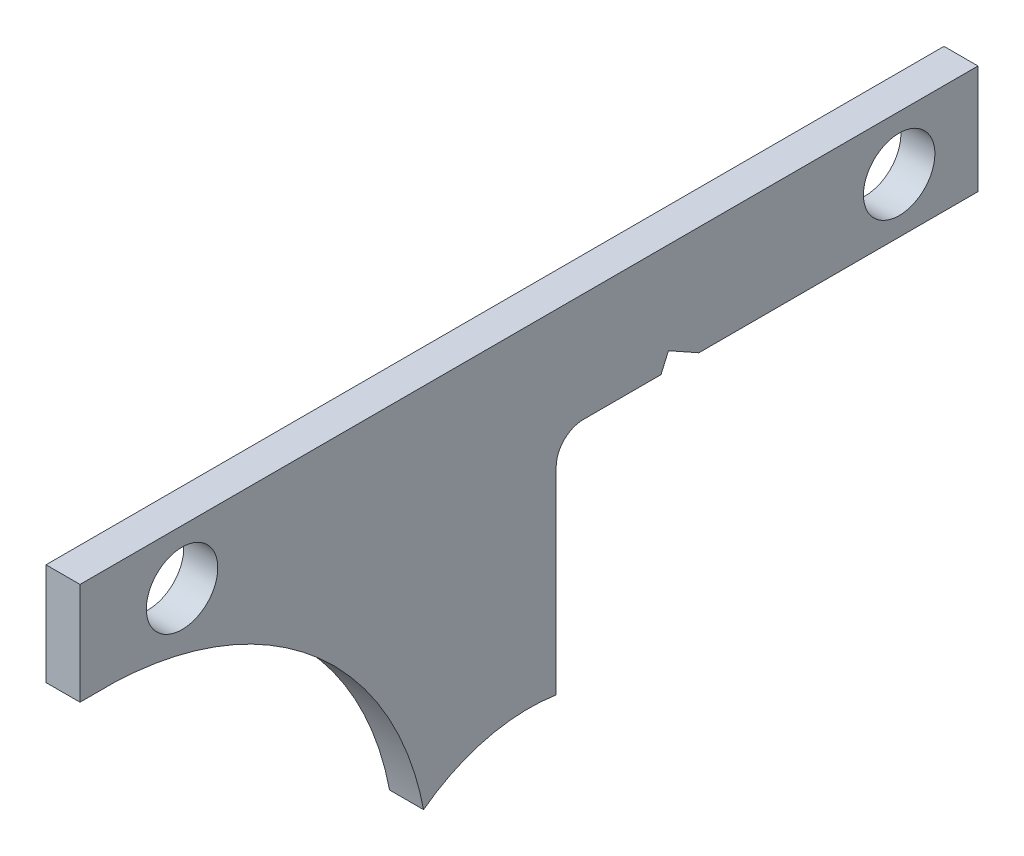
ISO-10303-21;
HEADER;
FILE_DESCRIPTION(('STEP AP214'),'2;1');
FILE_NAME('part.step','',(''),(''),'','','');
FILE_SCHEMA(('AUTOMOTIVE_DESIGN { 1 0 10303 214 1 1 1 1 }'));
ENDSEC;
DATA;
#1=APPLICATION_CONTEXT('core data for automotive mechanical design processes');
#2=APPLICATION_PROTOCOL_DEFINITION('international standard','automotive_design',2000,#1);
#3=PRODUCT_CONTEXT('',#1,'mechanical');
#4=PRODUCT('Part','Part','',(#3));
#5=PRODUCT_RELATED_PRODUCT_CATEGORY('part','',(#4));
#6=PRODUCT_DEFINITION_FORMATION('','',#4);
#7=PRODUCT_DEFINITION_CONTEXT('part definition',#1,'design');
#8=PRODUCT_DEFINITION('design','',#6,#7);
#9=PRODUCT_DEFINITION_SHAPE('','',#8);
#10=(LENGTH_UNIT() NAMED_UNIT(*) SI_UNIT(.MILLI.,.METRE.));
#11=(NAMED_UNIT(*) PLANE_ANGLE_UNIT() SI_UNIT($,.RADIAN.));
#12=(NAMED_UNIT(*) SI_UNIT($,.STERADIAN.) SOLID_ANGLE_UNIT());
#13=UNCERTAINTY_MEASURE_WITH_UNIT(LENGTH_MEASURE(1.E-05),#10,'distance_accuracy_value','');
#14=(GEOMETRIC_REPRESENTATION_CONTEXT(3) GLOBAL_UNCERTAINTY_ASSIGNED_CONTEXT((#13)) GLOBAL_UNIT_ASSIGNED_CONTEXT((#10,
#11,#12)) REPRESENTATION_CONTEXT('',''));
#15=CARTESIAN_POINT('',(0.,0.,0.));
#16=DIRECTION('',(0.,0.,1.));
#17=DIRECTION('',(1.,0.,0.));
#18=AXIS2_PLACEMENT_3D('',#15,#16,#17);
#19=CARTESIAN_POINT('',(-316.5,185.,219.999999999998));
#20=CARTESIAN_POINT('',(-316.5,183.738271044699,181.204081790223));
#21=CARTESIAN_POINT('',(-316.5,145.523335737097,174.397177271133));
#22=CARTESIAN_POINT('',(-321.5,185.,219.999999999998));
#23=CARTESIAN_POINT('',(-321.5,183.738271044699,181.204081790223));
#24=CARTESIAN_POINT('',(-321.5,145.523335737097,174.397177271133));
#25=(BOUNDED_SURFACE() B_SPLINE_SURFACE(1,2,((#19,#20,#21),(#22,#23,#24)),.UNSPECIFIED.,.F.,.F.,
.F.) B_SPLINE_SURFACE_WITH_KNOTS((2,2),(3,3),(-0.0104379405019257,0.0939414645173316),
(0.0325107499581212,1.3945234553188),
.UNSPECIFIED.) GEOMETRIC_REPRESENTATION_ITEM() RATIONAL_B_SPLINE_SURFACE(((1.,0.776939537570949,
1.),(1.,0.776939537570949,1.))) REPRESENTATION_ITEM('') SURFACE());
#26=DIRECTION('',(-1.,0.,0.));
#27=VECTOR('',#26,1.);
#28=CARTESIAN_POINT('',(-319.,146.074192797894,174.498623087635));
#29=LINE('',#28,#27);
#30=CARTESIAN_POINT('',(-316.5,146.074192797893,174.498623087637));
#31=VERTEX_POINT('',#30);
#32=CARTESIAN_POINT('',(-321.5,146.074192797894,174.498623087635));
#33=VERTEX_POINT('',#32);
#34=EDGE_CURVE('E323',#31,#33,#29,.T.);
#35=CARTESIAN_POINT('',(-316.5,185.,219.999999999998));
#36=CARTESIAN_POINT('',(-316.5,183.738271044699,181.204081790223));
#37=CARTESIAN_POINT('',(-316.5,145.523335737097,174.397177271133));
#38=(BOUNDED_CURVE() B_SPLINE_CURVE(2,(#35,#36,#37),.UNSPECIFIED.,.F.,
.F.) B_SPLINE_CURVE_WITH_KNOTS((3,3),(0.0325107499581212,1.3945234553188),
.UNSPECIFIED.) CURVE() GEOMETRIC_REPRESENTATION_ITEM() RATIONAL_B_SPLINE_CURVE((1.,
0.776939537570949,1.)) REPRESENTATION_ITEM(''));
#39=CARTESIAN_POINT('',(-316.5,185.,219.999999999998));
#40=VERTEX_POINT('',#39);
#41=EDGE_CURVE('E73',#40,#31,#38,.T.);
#42=CARTESIAN_POINT('',(-321.5,185.,219.999999999998));
#43=CARTESIAN_POINT('',(-316.5,185.,219.999999999998));
#44=(BOUNDED_CURVE() B_SPLINE_CURVE(1,(#42,#43),.UNSPECIFIED.,.F.,
.F.) B_SPLINE_CURVE_WITH_KNOTS((2,2),(-0.05,0.45),
.UNSPECIFIED.) CURVE() GEOMETRIC_REPRESENTATION_ITEM() RATIONAL_B_SPLINE_CURVE((1.,1.)) REPRESENTATION_ITEM(''));
#45=CARTESIAN_POINT('',(-321.5,185.,219.999999999998));
#46=VERTEX_POINT('',#45);
#47=EDGE_CURVE('E331',#46,#40,#44,.T.);
#48=CARTESIAN_POINT('',(-321.5,145.523335737097,174.397177271133));
#49=CARTESIAN_POINT('',(-321.5,183.738271044699,181.204081790223));
#50=CARTESIAN_POINT('',(-321.5,185.,219.999999999998));
#51=(BOUNDED_CURVE() B_SPLINE_CURVE(2,(#48,#49,#50),.UNSPECIFIED.,.F.,
.F.) B_SPLINE_CURVE_WITH_KNOTS((3,3),(-1.3945234553188,-0.0325107499581212),
.UNSPECIFIED.) CURVE() GEOMETRIC_REPRESENTATION_ITEM() RATIONAL_B_SPLINE_CURVE((1.,
0.776939537570949,1.)) REPRESENTATION_ITEM(''));
#52=EDGE_CURVE('E58',#33,#46,#51,.T.);
#53=ORIENTED_EDGE('',*,*,#34,.F.);
#54=ORIENTED_EDGE('',*,*,#41,.F.);
#55=ORIENTED_EDGE('',*,*,#47,.F.);
#56=ORIENTED_EDGE('',*,*,#52,.F.);
#57=EDGE_LOOP('',(#53,#54,#55,#56));
#58=FACE_BOUND('',#57,.T.);
#59=ADVANCED_FACE('F42',(#58),#25,.T.);
#60=CARTESIAN_POINT('',(-321.5,145.513335737097,225.009999999998));
#61=CARTESIAN_POINT('',(-321.5,145.513335737097,92.9900013881491));
#62=CARTESIAN_POINT('',(-321.5,200.01,225.009999999998));
#63=CARTESIAN_POINT('',(-321.5,200.01,92.9900013881491));
#64=(BOUNDED_SURFACE() B_SPLINE_SURFACE(1,1,((#60,#61),(#62,#63)),.UNSPECIFIED.,.F.,.F.,
.F.) B_SPLINE_SURFACE_WITH_KNOTS((2,2),(2,2),(1.2513335737095,6.70099999999985),
(-6.50099999999984,6.70099986118509),
.UNSPECIFIED.) GEOMETRIC_REPRESENTATION_ITEM() RATIONAL_B_SPLINE_SURFACE(((1.,1.),(1.,1.))) REPRESENTATION_ITEM('') SURFACE());
#65=CARTESIAN_POINT('',(-321.5,145.513335737097,175.217618448794));
#66=CARTESIAN_POINT('',(-321.5,145.817209579849,174.841987057817));
#67=CARTESIAN_POINT('',(-321.5,146.110495473394,174.457793135599));
#68=CARTESIAN_POINT('',(-321.5,146.675005811666,173.673552630524));
#69=CARTESIAN_POINT('',(-321.5,146.946231287544,173.273506789921));
#70=CARTESIAN_POINT('',(-321.5,147.465759656174,172.458806019936));
#71=CARTESIAN_POINT('',(-321.5,147.7140629169,172.044151325221));
#72=CARTESIAN_POINT('',(-321.5,148.186878352002,171.201706265423));
#73=CARTESIAN_POINT('',(-321.5,148.411399704459,170.773921050578));
#74=CARTESIAN_POINT('',(-321.5,148.836050954129,169.906408812612));
#75=CARTESIAN_POINT('',(-321.5,149.036181107614,169.466681915018));
#76=CARTESIAN_POINT('',(-321.5,149.411411039669,168.57670599091));
#77=CARTESIAN_POINT('',(-321.5,149.586510961507,168.126457024637));
#78=CARTESIAN_POINT('',(-321.5,149.992370235849,166.989175210884));
#79=CARTESIAN_POINT('',(-321.5,150.207149432196,166.29637503363));
#80=CARTESIAN_POINT('',(-321.5,150.577585473923,164.895016859683));
#81=CARTESIAN_POINT('',(-321.5,150.733234449333,164.186456778694));
#82=CARTESIAN_POINT('',(-321.5,150.921481465763,163.115958677762));
#83=CARTESIAN_POINT('',(-321.5,150.976690894647,162.757870023746));
#84=CARTESIAN_POINT('',(-321.5,151.071956667923,162.039786649967));
#85=CARTESIAN_POINT('',(-321.5,151.112017357181,161.679792506808));
#86=CARTESIAN_POINT('',(-321.5,151.209381289128,160.597696610315));
#87=CARTESIAN_POINT('',(-321.5,151.243876944847,159.8734213539));
#88=CARTESIAN_POINT('',(-321.5,151.251723571738,158.424552357231));
#89=CARTESIAN_POINT('',(-321.5,151.225075608174,157.699958622747));
#90=CARTESIAN_POINT('',(-321.5,151.139440788721,156.616891458317));
#91=CARTESIAN_POINT('',(-321.5,151.103282984392,156.256491813578));
#92=CARTESIAN_POINT('',(-321.5,151.015803959179,155.537433864738));
#93=CARTESIAN_POINT('',(-321.5,150.964478412316,155.178776087137));
#94=CARTESIAN_POINT('',(-321.5,150.787839974631,154.106298126963));
#95=CARTESIAN_POINT('',(-321.5,150.639873873459,153.396081780588));
#96=CARTESIAN_POINT('',(-321.5,150.284634531509,151.990767879744));
#97=CARTESIAN_POINT('',(-321.5,150.077368674467,151.295668454572));
#98=CARTESIAN_POINT('',(-321.5,149.678821076526,150.139465883939));
#99=CARTESIAN_POINT('',(-321.5,149.502752441013,149.673062074787));
#100=CARTESIAN_POINT('',(-321.5,149.123856517698,148.751206794664));
#101=CARTESIAN_POINT('',(-321.5,148.921028330392,148.295755692469));
#102=CARTESIAN_POINT('',(-321.5,148.489302619264,147.397374851677));
#103=CARTESIAN_POINT('',(-321.5,148.260404427979,146.954445434033));
#104=CARTESIAN_POINT('',(-321.5,147.777142656432,146.082295338665));
#105=CARTESIAN_POINT('',(-321.5,147.522761339425,145.653084487278));
#106=CARTESIAN_POINT('',(-321.5,146.989518862702,144.810146059111));
#107=CARTESIAN_POINT('',(-321.5,146.710657559965,144.39641857281));
#108=CARTESIAN_POINT('',(-321.5,146.129404425146,143.585819643031));
#109=CARTESIAN_POINT('',(-321.5,145.827011932484,143.188948673242));
#110=CARTESIAN_POINT('',(-321.5,145.513335737097,142.801202700822));
#111=B_SPLINE_CURVE_WITH_KNOTS('',3,(#65,#66,#67,#68,#69,#70,#71,#72,#73,#74,#75,#76,#77,#78,
#79,#80,#81,#82,#83,#84,#85,#86,#87,#88,#89,#90,#91,#92,#93,#94,#95,#96,#97,#98,#99,#100,#101,
#102,#103,#104,#105,#106,#107,#108,#109,#110),.UNSPECIFIED.,.F.,.F.,(4,2,2,2,2,2,2,2,2,2,2,2,2,
2,2,2,2,2,2,2,2,2,4),(0.,1.449269435888,2.89847109087236,4.34764947748894,5.79626653341593,
7.24486836769935,8.69346191022099,10.866775206997,13.0403776609012,14.1270565329776,
15.2134234939647,17.3859751423122,19.5584889400482,20.6448336994015,21.7314885938051,
23.9051237353821,26.0784883435558,27.5733020083385,29.0681659330912,30.56306813913,
32.0590181520337,33.5549769054268,35.0509776692748),.UNSPECIFIED.);
#112=CARTESIAN_POINT('',(-321.5,150.934388784605,155.));
#113=VERTEX_POINT('',#112);
#114=EDGE_CURVE('E64',#33,#113,#111,.T.);
#115=CARTESIAN_POINT('',(-321.5,185.,219.999999999998));
#116=CARTESIAN_POINT('',(-321.5,185.,224.999999999998));
#117=(BOUNDED_CURVE() B_SPLINE_CURVE(1,(#115,#116),.UNSPECIFIED.,.F.,
.F.) B_SPLINE_CURVE_WITH_KNOTS((2,2),(2.99999999999992,3.49999999999992),
.UNSPECIFIED.) CURVE() GEOMETRIC_REPRESENTATION_ITEM() RATIONAL_B_SPLINE_CURVE((1.,1.)) REPRESENTATION_ITEM(''));
#118=CARTESIAN_POINT('',(-321.5,185.,224.999999999998));
#119=VERTEX_POINT('',#118);
#120=EDGE_CURVE('E218',#46,#119,#117,.T.);
#121=CARTESIAN_POINT('',(-321.5,200.,224.999999999998));
#122=CARTESIAN_POINT('',(-321.5,185.,224.999999999998));
#123=(BOUNDED_CURVE() B_SPLINE_CURVE(1,(#121,#122),.UNSPECIFIED.,.F.,
.F.) B_SPLINE_CURVE_WITH_KNOTS((2,2),(-3.29999999999992,-1.79999999999992),
.UNSPECIFIED.) CURVE() GEOMETRIC_REPRESENTATION_ITEM() RATIONAL_B_SPLINE_CURVE((1.,1.)) REPRESENTATION_ITEM(''));
#124=CARTESIAN_POINT('',(-321.5,200.,224.999999999998));
#125=VERTEX_POINT('',#124);
#126=EDGE_CURVE('E149',#125,#119,#123,.T.);
#127=CARTESIAN_POINT('',(-321.5,200.,93.0000013881491));
#128=CARTESIAN_POINT('',(-321.5,200.,224.999999999998));
#129=(BOUNDED_CURVE() B_SPLINE_CURVE(1,(#127,#128),.UNSPECIFIED.,.F.,
.F.) B_SPLINE_CURVE_WITH_KNOTS((2,2),(-3.7000609657488,9.49993889543614),
.UNSPECIFIED.) CURVE() GEOMETRIC_REPRESENTATION_ITEM() RATIONAL_B_SPLINE_CURVE((1.,1.)) REPRESENTATION_ITEM(''));
#130=CARTESIAN_POINT('',(-321.5,200.,93.0000013881491));
#131=VERTEX_POINT('',#130);
#132=EDGE_CURVE('E154',#131,#125,#129,.T.);
#133=CARTESIAN_POINT('',(-321.5,184.000001489994,93.0000013881491));
#134=CARTESIAN_POINT('',(-321.5,200.,93.0000013881491));
#135=(BOUNDED_CURVE() B_SPLINE_CURVE(1,(#133,#134),.UNSPECIFIED.,.F.,
.F.) B_SPLINE_CURVE_WITH_KNOTS((2,2),(2.45000014899932,4.04999999999992),
.UNSPECIFIED.) CURVE() GEOMETRIC_REPRESENTATION_ITEM() RATIONAL_B_SPLINE_CURVE((1.,1.)) REPRESENTATION_ITEM(''));
#136=CARTESIAN_POINT('',(-321.5,184.000001489994,93.0000013881491));
#137=VERTEX_POINT('',#136);
#138=EDGE_CURVE('E322',#137,#131,#135,.T.);
#139=CARTESIAN_POINT('',(-321.5,184.000001489994,93.0000013881491));
#140=CARTESIAN_POINT('',(-321.5,184.000001489994,134.029372648002));
#141=(BOUNDED_CURVE() B_SPLINE_CURVE(1,(#139,#140),.UNSPECIFIED.,.F.,
.F.) B_SPLINE_CURVE_WITH_KNOTS((2,2),(-6.19999986118509,-2.09706273519983),
.UNSPECIFIED.) CURVE() GEOMETRIC_REPRESENTATION_ITEM() RATIONAL_B_SPLINE_CURVE((1.,1.)) REPRESENTATION_ITEM(''));
#142=CARTESIAN_POINT('',(-321.5,184.000001489994,134.029372648002));
#143=VERTEX_POINT('',#142);
#144=EDGE_CURVE('E210',#137,#143,#141,.T.);
#145=CARTESIAN_POINT('',(-321.5,184.000001489994,134.029372648002));
#146=CARTESIAN_POINT('',(-321.5,186.499999798834,138.499999679625));
#147=(BOUNDED_CURVE() B_SPLINE_CURVE(1,(#145,#146),.UNSPECIFIED.,.F.,
.F.) B_SPLINE_CURVE_WITH_KNOTS((2,2),(-0.144876145952486,0.367339605465649),
.UNSPECIFIED.) CURVE() GEOMETRIC_REPRESENTATION_ITEM() RATIONAL_B_SPLINE_CURVE((1.,1.)) REPRESENTATION_ITEM(''));
#148=CARTESIAN_POINT('',(-321.5,186.499999798834,138.499999679625));
#149=VERTEX_POINT('',#148);
#150=EDGE_CURVE('E219',#143,#149,#147,.T.);
#151=CARTESIAN_POINT('',(-321.5,186.499999798834,138.499999679625));
#152=CARTESIAN_POINT('',(-321.5,184.000001489994,139.600149694138));
#153=(BOUNDED_CURVE() B_SPLINE_CURVE(1,(#151,#152),.UNSPECIFIED.,.F.,
.F.) B_SPLINE_CURVE_WITH_KNOTS((2,2),(-3.01797486716644,-2.74483897427363),
.UNSPECIFIED.) CURVE() GEOMETRIC_REPRESENTATION_ITEM() RATIONAL_B_SPLINE_CURVE((1.,1.)) REPRESENTATION_ITEM(''));
#154=CARTESIAN_POINT('',(-321.5,184.000001489994,139.600149694138));
#155=VERTEX_POINT('',#154);
#156=EDGE_CURVE('E182',#149,#155,#153,.T.);
#157=CARTESIAN_POINT('',(-321.5,184.000001489994,139.600149694138));
#158=CARTESIAN_POINT('',(-321.5,184.000001489994,151.));
#159=(BOUNDED_CURVE() B_SPLINE_CURVE(1,(#157,#158),.UNSPECIFIED.,.F.,
.F.) B_SPLINE_CURVE_WITH_KNOTS((2,2),(-1.28998503058624,-0.150000000000003),
.UNSPECIFIED.) CURVE() GEOMETRIC_REPRESENTATION_ITEM() RATIONAL_B_SPLINE_CURVE((1.,1.)) REPRESENTATION_ITEM(''));
#160=CARTESIAN_POINT('',(-321.5,184.000001489994,151.));
#161=VERTEX_POINT('',#160);
#162=EDGE_CURVE('E178',#155,#161,#159,.T.);
#163=CARTESIAN_POINT('',(-321.5,180.000001489994,155.));
#164=CARTESIAN_POINT('',(-321.5,184.000001489994,155.));
#165=CARTESIAN_POINT('',(-321.5,184.000001489994,151.));
#166=(BOUNDED_CURVE() B_SPLINE_CURVE(2,(#163,#164,#165),.UNSPECIFIED.,.F.,
.F.) B_SPLINE_CURVE_WITH_KNOTS((3,3),(-0.785398163397449,0.785398163397448),
.UNSPECIFIED.) CURVE() GEOMETRIC_REPRESENTATION_ITEM() RATIONAL_B_SPLINE_CURVE((1.,
0.707106781186548,1.)) REPRESENTATION_ITEM(''));
#167=CARTESIAN_POINT('',(-321.5,180.000001489994,155.));
#168=VERTEX_POINT('',#167);
#169=EDGE_CURVE('E163',#168,#161,#166,.T.);
#170=CARTESIAN_POINT('',(-321.5,150.42810164539,155.));
#171=CARTESIAN_POINT('',(-321.5,180.000001489994,155.));
#172=(BOUNDED_CURVE() B_SPLINE_CURVE(1,(#170,#171),.UNSPECIFIED.,.F.,
.F.) B_SPLINE_CURVE_WITH_KNOTS((2,2),(0.868885329190994,3.82607531365144),
.UNSPECIFIED.) CURVE() GEOMETRIC_REPRESENTATION_ITEM() RATIONAL_B_SPLINE_CURVE((1.,1.)) REPRESENTATION_ITEM(''));
#173=EDGE_CURVE('E375',#113,#168,#172,.T.);
#174=CARTESIAN_POINT('',(-321.5,186.750000000002,210.));
#175=CARTESIAN_POINT('',(-321.5,186.750000000002,204.75));
#176=CARTESIAN_POINT('',(-321.5,192.000000000002,204.75));
#177=CARTESIAN_POINT('',(-321.5,197.250000000002,204.75));
#178=CARTESIAN_POINT('',(-321.5,197.250000000002,210.));
#179=CARTESIAN_POINT('',(-321.5,197.250000000002,215.25));
#180=CARTESIAN_POINT('',(-321.5,192.000000000002,215.25));
#181=CARTESIAN_POINT('',(-321.5,186.750000000002,215.25));
#182=CARTESIAN_POINT('',(-321.5,186.750000000002,210.));
#183=(BOUNDED_CURVE() B_SPLINE_CURVE(2,(#174,#175,#176,#177,#178,#179,#180,#181,#182),
.UNSPECIFIED.,.T.,.F.) B_SPLINE_CURVE_WITH_KNOTS((3,2,2,2,3),(-3.14159265358979,
-1.5707963267949,0.,1.5707963267949,3.14159265358979),
.UNSPECIFIED.) CURVE() GEOMETRIC_REPRESENTATION_ITEM() RATIONAL_B_SPLINE_CURVE((1.,
0.707106781186547,1.,0.707106781186547,1.,0.707106781186547,1.,0.707106781186547,1.)) REPRESENTATION_ITEM(''));
#184=CARTESIAN_POINT('',(-321.5,186.750000000002,210.));
#185=VERTEX_POINT('',#184);
#186=EDGE_CURVE('E187',#185,#185,#183,.T.);
#187=CARTESIAN_POINT('',(-321.5,186.750000000002,104.591492462718));
#188=CARTESIAN_POINT('',(-321.5,186.750000000002,99.3414924627182));
#189=CARTESIAN_POINT('',(-321.5,192.000000000002,99.3414924627182));
#190=CARTESIAN_POINT('',(-321.5,197.250000000002,99.3414924627182));
#191=CARTESIAN_POINT('',(-321.5,197.250000000002,104.591492462718));
#192=CARTESIAN_POINT('',(-321.5,197.250000000002,109.841492462718));
#193=CARTESIAN_POINT('',(-321.5,192.000000000002,109.841492462718));
#194=CARTESIAN_POINT('',(-321.5,186.750000000002,109.841492462718));
#195=CARTESIAN_POINT('',(-321.5,186.750000000002,104.591492462718));
#196=(BOUNDED_CURVE() B_SPLINE_CURVE(2,(#187,#188,#189,#190,#191,#192,#193,#194,#195),
.UNSPECIFIED.,.T.,.F.) B_SPLINE_CURVE_WITH_KNOTS((3,2,2,2,3),(-3.14159265358979,
-1.5707963267949,0.,1.5707963267949,3.14159265358979),
.UNSPECIFIED.) CURVE() GEOMETRIC_REPRESENTATION_ITEM() RATIONAL_B_SPLINE_CURVE((1.,
0.707106781186547,1.,0.707106781186547,1.,0.707106781186547,1.,0.707106781186547,1.)) REPRESENTATION_ITEM(''));
#197=CARTESIAN_POINT('',(-321.5,186.750000000002,104.591492462718));
#198=VERTEX_POINT('',#197);
#199=EDGE_CURVE('E282',#198,#198,#196,.T.);
#200=ORIENTED_EDGE('',*,*,#114,.F.);
#201=ORIENTED_EDGE('',*,*,#52,.T.);
#202=ORIENTED_EDGE('',*,*,#120,.T.);
#203=ORIENTED_EDGE('',*,*,#126,.F.);
#204=ORIENTED_EDGE('',*,*,#132,.F.);
#205=ORIENTED_EDGE('',*,*,#138,.F.);
#206=ORIENTED_EDGE('',*,*,#144,.T.);
#207=ORIENTED_EDGE('',*,*,#150,.T.);
#208=ORIENTED_EDGE('',*,*,#156,.T.);
#209=ORIENTED_EDGE('',*,*,#162,.T.);
#210=ORIENTED_EDGE('',*,*,#169,.F.);
#211=ORIENTED_EDGE('',*,*,#173,.F.);
#212=EDGE_LOOP('',(#200,#201,#202,#203,#204,#205,#206,#207,#208,#209,#210,#211));
#213=FACE_BOUND('',#212,.T.);
#214=ORIENTED_EDGE('',*,*,#186,.T.);
#215=EDGE_LOOP('',(#214));
#216=FACE_BOUND('',#215,.T.);
#217=ORIENTED_EDGE('',*,*,#199,.T.);
#218=EDGE_LOOP('',(#217));
#219=FACE_BOUND('',#218,.T.);
#220=ADVANCED_FACE('F179',(#213,#216,#219),#64,.T.);
#221=CARTESIAN_POINT('',(-321.51,185.,219.989999999998));
#222=CARTESIAN_POINT('',(-321.51,185.,225.009999999998));
#223=CARTESIAN_POINT('',(-316.49,185.,219.989999999998));
#224=CARTESIAN_POINT('',(-316.49,185.,225.009999999998));
#225=(BOUNDED_SURFACE() B_SPLINE_SURFACE(1,1,((#221,#222),(#223,#224)),.UNSPECIFIED.,.F.,.F.,
.F.) B_SPLINE_SURFACE_WITH_KNOTS((2,2),(2,2),(-0.051,0.451),(-0.001,0.501),
.UNSPECIFIED.) GEOMETRIC_REPRESENTATION_ITEM() RATIONAL_B_SPLINE_SURFACE(((1.,1.),(1.,1.))) REPRESENTATION_ITEM('') SURFACE());
#226=CARTESIAN_POINT('',(-316.5,185.,219.999999999998));
#227=CARTESIAN_POINT('',(-316.5,185.,224.999999999998));
#228=(BOUNDED_CURVE() B_SPLINE_CURVE(1,(#226,#227),.UNSPECIFIED.,.F.,
.F.) B_SPLINE_CURVE_WITH_KNOTS((2,2),(2.99999999999992,3.49999999999992),
.UNSPECIFIED.) CURVE() GEOMETRIC_REPRESENTATION_ITEM() RATIONAL_B_SPLINE_CURVE((1.,1.)) REPRESENTATION_ITEM(''));
#229=CARTESIAN_POINT('',(-316.5,185.,224.999999999998));
#230=VERTEX_POINT('',#229);
#231=EDGE_CURVE('E206',#40,#230,#228,.T.);
#232=CARTESIAN_POINT('',(-321.5,185.,224.999999999998));
#233=CARTESIAN_POINT('',(-316.5,185.,224.999999999998));
#234=(BOUNDED_CURVE() B_SPLINE_CURVE(1,(#232,#233),.UNSPECIFIED.,.F.,
.F.) B_SPLINE_CURVE_WITH_KNOTS((2,2),(-0.05,0.45),
.UNSPECIFIED.) CURVE() GEOMETRIC_REPRESENTATION_ITEM() RATIONAL_B_SPLINE_CURVE((1.,1.)) REPRESENTATION_ITEM(''));
#235=EDGE_CURVE('E344',#119,#230,#234,.T.);
#236=ORIENTED_EDGE('',*,*,#120,.F.);
#237=ORIENTED_EDGE('',*,*,#47,.T.);
#238=ORIENTED_EDGE('',*,*,#231,.T.);
#239=ORIENTED_EDGE('',*,*,#235,.F.);
#240=EDGE_LOOP('',(#236,#237,#238,#239));
#241=FACE_BOUND('',#240,.T.);
#242=ADVANCED_FACE('F745',(#241),#225,.T.);
#243=CARTESIAN_POINT('',(-316.49,184.99,224.999999999998));
#244=CARTESIAN_POINT('',(-321.51,184.99,224.999999999998));
#245=CARTESIAN_POINT('',(-316.49,200.01,224.999999999998));
#246=CARTESIAN_POINT('',(-321.51,200.01,224.999999999998));
#247=(BOUNDED_SURFACE() B_SPLINE_SURFACE(1,1,((#243,#244),(#245,#246)),.UNSPECIFIED.,.F.,.F.,
.F.) B_SPLINE_SURFACE_WITH_KNOTS((2,2),(2,2),(-1.601,-0.099),(-0.451,0.051),
.UNSPECIFIED.) GEOMETRIC_REPRESENTATION_ITEM() RATIONAL_B_SPLINE_SURFACE(((1.,1.),(1.,1.))) REPRESENTATION_ITEM('') SURFACE());
#248=CARTESIAN_POINT('',(-316.5,185.,224.999999999998));
#249=CARTESIAN_POINT('',(-316.5,200.,224.999999999998));
#250=(BOUNDED_CURVE() B_SPLINE_CURVE(1,(#248,#249),.UNSPECIFIED.,.F.,
.F.) B_SPLINE_CURVE_WITH_KNOTS((2,2),(1.79999999999992,3.29999999999992),
.UNSPECIFIED.) CURVE() GEOMETRIC_REPRESENTATION_ITEM() RATIONAL_B_SPLINE_CURVE((1.,1.)) REPRESENTATION_ITEM(''));
#251=CARTESIAN_POINT('',(-316.5,200.,224.999999999998));
#252=VERTEX_POINT('',#251);
#253=EDGE_CURVE('E243',#230,#252,#250,.T.);
#254=CARTESIAN_POINT('',(-316.5,200.,224.999999999998));
#255=CARTESIAN_POINT('',(-321.5,200.,224.999999999998));
#256=(BOUNDED_CURVE() B_SPLINE_CURVE(1,(#254,#255),.UNSPECIFIED.,.F.,
.F.) B_SPLINE_CURVE_WITH_KNOTS((2,2),(-0.45,0.05),
.UNSPECIFIED.) CURVE() GEOMETRIC_REPRESENTATION_ITEM() RATIONAL_B_SPLINE_CURVE((1.,1.)) REPRESENTATION_ITEM(''));
#257=EDGE_CURVE('E128',#252,#125,#256,.T.);
#258=ORIENTED_EDGE('',*,*,#235,.T.);
#259=ORIENTED_EDGE('',*,*,#253,.T.);
#260=ORIENTED_EDGE('',*,*,#257,.T.);
#261=ORIENTED_EDGE('',*,*,#126,.T.);
#262=EDGE_LOOP('',(#258,#259,#260,#261));
#263=FACE_BOUND('',#262,.T.);
#264=ADVANCED_FACE('F738',(#263),#247,.T.);
#265=CARTESIAN_POINT('',(-316.49,183.995120737495,134.020644632475));
#266=CARTESIAN_POINT('',(-321.51,183.995120737495,134.020644632475));
#267=CARTESIAN_POINT('',(-316.49,186.504880551334,138.508727695152));
#268=CARTESIAN_POINT('',(-321.51,186.504880551334,138.508727695152));
#269=(BOUNDED_SURFACE() B_SPLINE_SURFACE(1,1,((#265,#266),(#267,#268)),.UNSPECIFIED.,.F.,.F.,
.F.) B_SPLINE_SURFACE_WITH_KNOTS((2,2),(2,2),(-0.0010000000000005,0.513215751418136),(-0.051,
0.451),.UNSPECIFIED.) GEOMETRIC_REPRESENTATION_ITEM() RATIONAL_B_SPLINE_SURFACE(((1.,1.),(1.,1.))) REPRESENTATION_ITEM('') SURFACE());
#270=CARTESIAN_POINT('',(-316.5,186.499999798834,138.499999679625));
#271=CARTESIAN_POINT('',(-316.5,184.000002920505,134.029375206115));
#272=(BOUNDED_CURVE() B_SPLINE_CURVE(1,(#270,#271),.UNSPECIFIED.,.F.,
.F.) B_SPLINE_CURVE_WITH_KNOTS((2,2),(-0.367339605465649,0.144875852860258),
.UNSPECIFIED.) CURVE() GEOMETRIC_REPRESENTATION_ITEM() RATIONAL_B_SPLINE_CURVE((1.,1.)) REPRESENTATION_ITEM(''));
#273=CARTESIAN_POINT('',(-316.5,186.499999798834,138.499999679625));
#274=VERTEX_POINT('',#273);
#275=CARTESIAN_POINT('',(-316.5,184.000001489994,134.029372648002));
#276=VERTEX_POINT('',#275);
#277=EDGE_CURVE('E120',#274,#276,#272,.T.);
#278=CARTESIAN_POINT('',(-316.5,186.499999798834,138.499999679625));
#279=CARTESIAN_POINT('',(-321.5,186.499999798834,138.499999679625));
#280=(BOUNDED_CURVE() B_SPLINE_CURVE(1,(#278,#279),.UNSPECIFIED.,.F.,
.F.) B_SPLINE_CURVE_WITH_KNOTS((2,2),(-0.05,0.45),
.UNSPECIFIED.) CURVE() GEOMETRIC_REPRESENTATION_ITEM() RATIONAL_B_SPLINE_CURVE((1.,1.)) REPRESENTATION_ITEM(''));
#281=EDGE_CURVE('E397',#274,#149,#280,.T.);
#282=CARTESIAN_POINT('',(-316.5,184.000001489994,134.029372648002));
#283=CARTESIAN_POINT('',(-321.5,184.000001489994,134.029372648002));
#284=(BOUNDED_CURVE() B_SPLINE_CURVE(1,(#282,#283),.UNSPECIFIED.,.F.,
.F.) B_SPLINE_CURVE_WITH_KNOTS((2,2),(-0.25,0.25),
.UNSPECIFIED.) CURVE() GEOMETRIC_REPRESENTATION_ITEM() RATIONAL_B_SPLINE_CURVE((1.,1.)) REPRESENTATION_ITEM(''));
#285=EDGE_CURVE('E264',#276,#143,#284,.T.);
#286=ORIENTED_EDGE('',*,*,#277,.F.);
#287=ORIENTED_EDGE('',*,*,#281,.T.);
#288=ORIENTED_EDGE('',*,*,#150,.F.);
#289=ORIENTED_EDGE('',*,*,#285,.F.);
#290=EDGE_LOOP('',(#286,#287,#288,#289));
#291=FACE_BOUND('',#290,.T.);
#292=ADVANCED_FACE('F719',(#291),#269,.T.);
#293=CARTESIAN_POINT('',(-316.49,186.509152745678,138.495971831059));
#294=CARTESIAN_POINT('',(-321.51,186.509152745678,138.495971831059));
#295=CARTESIAN_POINT('',(-316.49,183.99084854315,139.604177542704));
#296=CARTESIAN_POINT('',(-321.51,183.99084854315,139.604177542704));
#297=(BOUNDED_SURFACE() B_SPLINE_SURFACE(1,1,((#293,#294),(#295,#296)),.UNSPECIFIED.,.F.,.F.,
.F.) B_SPLINE_SURFACE_WITH_KNOTS((2,2),(2,2),(-0.00100015628954575,0.274135736603264),(-0.051,
0.451),.UNSPECIFIED.) GEOMETRIC_REPRESENTATION_ITEM() RATIONAL_B_SPLINE_SURFACE(((1.,1.),(1.,1.))) REPRESENTATION_ITEM('') SURFACE());
#298=CARTESIAN_POINT('',(-316.5,184.000001489994,139.600149694138));
#299=CARTESIAN_POINT('',(-316.5,186.499999798834,138.499999679625));
#300=(BOUNDED_CURVE() B_SPLINE_CURVE(1,(#298,#299),.UNSPECIFIED.,.F.,
.F.) B_SPLINE_CURVE_WITH_KNOTS((2,2),(2.74483897427363,3.01797486716644),
.UNSPECIFIED.) CURVE() GEOMETRIC_REPRESENTATION_ITEM() RATIONAL_B_SPLINE_CURVE((1.,1.)) REPRESENTATION_ITEM(''));
#301=CARTESIAN_POINT('',(-316.5,184.000001489994,139.600149694138));
#302=VERTEX_POINT('',#301);
#303=EDGE_CURVE('E359',#302,#274,#300,.T.);
#304=CARTESIAN_POINT('',(-321.5,184.000001489994,139.600149694138));
#305=CARTESIAN_POINT('',(-316.5,184.000001489994,139.600149694138));
#306=(BOUNDED_CURVE() B_SPLINE_CURVE(1,(#304,#305),.UNSPECIFIED.,.F.,
.F.) B_SPLINE_CURVE_WITH_KNOTS((2,2),(-0.25,0.25),
.UNSPECIFIED.) CURVE() GEOMETRIC_REPRESENTATION_ITEM() RATIONAL_B_SPLINE_CURVE((1.,1.)) REPRESENTATION_ITEM(''));
#307=EDGE_CURVE('E227',#155,#302,#306,.T.);
#308=ORIENTED_EDGE('',*,*,#303,.F.);
#309=ORIENTED_EDGE('',*,*,#307,.F.);
#310=ORIENTED_EDGE('',*,*,#156,.F.);
#311=ORIENTED_EDGE('',*,*,#281,.F.);
#312=EDGE_LOOP('',(#308,#309,#310,#311));
#313=FACE_BOUND('',#312,.T.);
#314=ADVANCED_FACE('F699',(#313),#297,.T.);
#315=CARTESIAN_POINT('',(-321.51,184.000001489994,134.039372648002));
#316=CARTESIAN_POINT('',(-316.49,184.000001489994,134.039372648002));
#317=CARTESIAN_POINT('',(-321.51,184.000001489994,92.9900013881491));
#318=CARTESIAN_POINT('',(-316.49,184.000001489994,92.9900013881491));
#319=(BOUNDED_SURFACE() B_SPLINE_SURFACE(1,1,((#315,#316),(#317,#318)),.UNSPECIFIED.,.F.,.F.,
.F.) B_SPLINE_SURFACE_WITH_KNOTS((2,2),(2,2),(1.59606273519983,5.70099986118508),(-0.051,0.451),
.UNSPECIFIED.) GEOMETRIC_REPRESENTATION_ITEM() RATIONAL_B_SPLINE_SURFACE(((1.,1.),(1.,1.))) REPRESENTATION_ITEM('') SURFACE());
#320=CARTESIAN_POINT('',(-321.5,184.000001489994,93.0000013881491));
#321=CARTESIAN_POINT('',(-316.5,184.000001489994,93.0000013881491));
#322=(BOUNDED_CURVE() B_SPLINE_CURVE(1,(#320,#321),.UNSPECIFIED.,.F.,
.F.) B_SPLINE_CURVE_WITH_KNOTS((2,2),(-0.05,0.45),
.UNSPECIFIED.) CURVE() GEOMETRIC_REPRESENTATION_ITEM() RATIONAL_B_SPLINE_CURVE((1.,1.)) REPRESENTATION_ITEM(''));
#323=CARTESIAN_POINT('',(-316.5,184.000001489994,93.0000013881491));
#324=VERTEX_POINT('',#323);
#325=EDGE_CURVE('E255',#137,#324,#322,.T.);
#326=CARTESIAN_POINT('',(-316.5,184.000001489994,134.029372648002));
#327=CARTESIAN_POINT('',(-316.5,184.000001489994,93.0000013881491));
#328=(BOUNDED_CURVE() B_SPLINE_CURVE(1,(#326,#327),.UNSPECIFIED.,.F.,
.F.) B_SPLINE_CURVE_WITH_KNOTS((2,2),(2.09706273519983,6.19999986118509),
.UNSPECIFIED.) CURVE() GEOMETRIC_REPRESENTATION_ITEM() RATIONAL_B_SPLINE_CURVE((1.,1.)) REPRESENTATION_ITEM(''));
#329=EDGE_CURVE('E253',#276,#324,#328,.T.);
#330=ORIENTED_EDGE('',*,*,#285,.T.);
#331=ORIENTED_EDGE('',*,*,#144,.F.);
#332=ORIENTED_EDGE('',*,*,#325,.T.);
#333=ORIENTED_EDGE('',*,*,#329,.F.);
#334=EDGE_LOOP('',(#330,#331,#332,#333));
#335=FACE_BOUND('',#334,.T.);
#336=ADVANCED_FACE('F677',(#335),#319,.T.);
#337=CARTESIAN_POINT('',(-321.51,184.000001489994,151.01));
#338=CARTESIAN_POINT('',(-316.49,184.000001489994,151.01));
#339=CARTESIAN_POINT('',(-321.51,184.000001489994,139.590149694138));
#340=CARTESIAN_POINT('',(-316.49,184.000001489994,139.590149694138));
#341=(BOUNDED_SURFACE() B_SPLINE_SURFACE(1,1,((#337,#338),(#339,#340)),.UNSPECIFIED.,.F.,.F.,
.F.) B_SPLINE_SURFACE_WITH_KNOTS((2,2),(2,2),(-0.601,0.540985030586231),(-0.051,0.451),
.UNSPECIFIED.) GEOMETRIC_REPRESENTATION_ITEM() RATIONAL_B_SPLINE_SURFACE(((1.,1.),(1.,1.))) REPRESENTATION_ITEM('') SURFACE());
#342=CARTESIAN_POINT('',(-316.5,184.000001489994,151.));
#343=CARTESIAN_POINT('',(-316.5,184.000001489994,139.600149694138));
#344=(BOUNDED_CURVE() B_SPLINE_CURVE(1,(#342,#343),.UNSPECIFIED.,.F.,
.F.) B_SPLINE_CURVE_WITH_KNOTS((2,2),(0.150000000000003,1.28998503058624),
.UNSPECIFIED.) CURVE() GEOMETRIC_REPRESENTATION_ITEM() RATIONAL_B_SPLINE_CURVE((1.,1.)) REPRESENTATION_ITEM(''));
#345=CARTESIAN_POINT('',(-316.5,184.000001489994,151.));
#346=VERTEX_POINT('',#345);
#347=EDGE_CURVE('E191',#346,#302,#344,.T.);
#348=CARTESIAN_POINT('',(-321.5,184.000001489994,151.));
#349=CARTESIAN_POINT('',(-316.5,184.000001489994,151.));
#350=(BOUNDED_CURVE() B_SPLINE_CURVE(1,(#348,#349),.UNSPECIFIED.,.F.,
.F.) B_SPLINE_CURVE_WITH_KNOTS((2,2),(-0.05,0.45),
.UNSPECIFIED.) CURVE() GEOMETRIC_REPRESENTATION_ITEM() RATIONAL_B_SPLINE_CURVE((1.,1.)) REPRESENTATION_ITEM(''));
#351=EDGE_CURVE('E168',#161,#346,#350,.T.);
#352=ORIENTED_EDGE('',*,*,#307,.T.);
#353=ORIENTED_EDGE('',*,*,#347,.F.);
#354=ORIENTED_EDGE('',*,*,#351,.F.);
#355=ORIENTED_EDGE('',*,*,#162,.F.);
#356=EDGE_LOOP('',(#352,#353,#354,#355));
#357=FACE_BOUND('',#356,.T.);
#358=ADVANCED_FACE('F189',(#357),#341,.T.);
#359=CARTESIAN_POINT('',(-316.5,200.01,225.009999999998));
#360=CARTESIAN_POINT('',(-316.5,200.01,92.9900013881491));
#361=CARTESIAN_POINT('',(-316.5,145.513335737097,225.009999999998));
#362=CARTESIAN_POINT('',(-316.5,145.513335737097,92.9900013881491));
#363=(BOUNDED_SURFACE() B_SPLINE_SURFACE(1,1,((#359,#360),(#361,#362)),.UNSPECIFIED.,.F.,.F.,
.F.) B_SPLINE_SURFACE_WITH_KNOTS((2,2),(2,2),(1.2513335737095,6.70099999999985),
(-6.50099999999984,6.70099986118509),
.UNSPECIFIED.) GEOMETRIC_REPRESENTATION_ITEM() RATIONAL_B_SPLINE_SURFACE(((1.,1.),(1.,1.))) REPRESENTATION_ITEM('') SURFACE());
#364=CARTESIAN_POINT('',(-316.5,125.476378776776,159.009410574808));
#365=DIRECTION('',(1.,0.,0.));
#366=DIRECTION('',(0.,0.,-1.));
#367=AXIS2_PLACEMENT_3D('',#364,#365,#366);
#368=CIRCLE('',#367,25.7717994466066);
#369=CARTESIAN_POINT('',(-316.5,150.934388784605,155.));
#370=VERTEX_POINT('',#369);
#371=EDGE_CURVE('E939',#370,#31,#368,.T.);
#372=CARTESIAN_POINT('',(-316.5,150.42810164539,155.));
#373=CARTESIAN_POINT('',(-316.5,180.000001489994,155.));
#374=(BOUNDED_CURVE() B_SPLINE_CURVE(1,(#372,#373),.UNSPECIFIED.,.F.,
.F.) B_SPLINE_CURVE_WITH_KNOTS((2,2),(0.868885329190994,3.82607531365144),
.UNSPECIFIED.) CURVE() GEOMETRIC_REPRESENTATION_ITEM() RATIONAL_B_SPLINE_CURVE((1.,1.)) REPRESENTATION_ITEM(''));
#375=CARTESIAN_POINT('',(-316.5,180.000001489994,155.));
#376=VERTEX_POINT('',#375);
#377=EDGE_CURVE('E228',#370,#376,#374,.T.);
#378=CARTESIAN_POINT('',(-316.5,184.000001489994,151.));
#379=CARTESIAN_POINT('',(-316.5,184.000001489994,155.));
#380=CARTESIAN_POINT('',(-316.5,180.000001489994,155.));
#381=(BOUNDED_CURVE() B_SPLINE_CURVE(2,(#378,#379,#380),.UNSPECIFIED.,.F.,
.F.) B_SPLINE_CURVE_WITH_KNOTS((3,3),(-0.785398163397448,0.785398163397449),
.UNSPECIFIED.) CURVE() GEOMETRIC_REPRESENTATION_ITEM() RATIONAL_B_SPLINE_CURVE((1.,
0.707106781186548,1.)) REPRESENTATION_ITEM(''));
#382=EDGE_CURVE('E194',#346,#376,#381,.T.);
#383=CARTESIAN_POINT('',(-316.5,184.000001489994,93.0000013881491));
#384=CARTESIAN_POINT('',(-316.5,200.,93.0000013881491));
#385=(BOUNDED_CURVE() B_SPLINE_CURVE(1,(#383,#384),.UNSPECIFIED.,.F.,
.F.) B_SPLINE_CURVE_WITH_KNOTS((2,2),(2.45000014899932,4.04999999999992),
.UNSPECIFIED.) CURVE() GEOMETRIC_REPRESENTATION_ITEM() RATIONAL_B_SPLINE_CURVE((1.,1.)) REPRESENTATION_ITEM(''));
#386=CARTESIAN_POINT('',(-316.5,200.,93.0000013881491));
#387=VERTEX_POINT('',#386);
#388=EDGE_CURVE('E244',#324,#387,#385,.T.);
#389=CARTESIAN_POINT('',(-316.5,200.,93.0000013881491));
#390=CARTESIAN_POINT('',(-316.5,200.,224.999999999998));
#391=(BOUNDED_CURVE() B_SPLINE_CURVE(1,(#389,#390),.UNSPECIFIED.,.F.,
.F.) B_SPLINE_CURVE_WITH_KNOTS((2,2),(-3.7000609657488,9.49993889543614),
.UNSPECIFIED.) CURVE() GEOMETRIC_REPRESENTATION_ITEM() RATIONAL_B_SPLINE_CURVE((1.,1.)) REPRESENTATION_ITEM(''));
#392=EDGE_CURVE('E254',#387,#252,#391,.T.);
#393=CARTESIAN_POINT('',(-316.5,186.750000000002,210.));
#394=CARTESIAN_POINT('',(-316.5,186.750000000002,215.25));
#395=CARTESIAN_POINT('',(-316.5,192.000000000002,215.25));
#396=CARTESIAN_POINT('',(-316.5,197.250000000002,215.25));
#397=CARTESIAN_POINT('',(-316.5,197.250000000002,210.));
#398=CARTESIAN_POINT('',(-316.5,197.250000000002,204.75));
#399=CARTESIAN_POINT('',(-316.5,192.000000000002,204.75));
#400=CARTESIAN_POINT('',(-316.5,186.750000000002,204.75));
#401=CARTESIAN_POINT('',(-316.5,186.750000000002,210.));
#402=(BOUNDED_CURVE() B_SPLINE_CURVE(2,(#393,#394,#395,#396,#397,#398,#399,#400,#401),
.UNSPECIFIED.,.T.,.F.) B_SPLINE_CURVE_WITH_KNOTS((3,2,2,2,3),(-3.14159265358979,
-1.5707963267949,0.,1.5707963267949,3.14159265358979),
.UNSPECIFIED.) CURVE() GEOMETRIC_REPRESENTATION_ITEM() RATIONAL_B_SPLINE_CURVE((1.,
0.707106781186547,1.,0.707106781186547,1.,0.707106781186547,1.,0.707106781186547,1.)) REPRESENTATION_ITEM(''));
#403=CARTESIAN_POINT('',(-316.5,186.750000000002,210.));
#404=VERTEX_POINT('',#403);
#405=EDGE_CURVE('E273',#404,#404,#402,.T.);
#406=CARTESIAN_POINT('',(-316.5,186.750000000002,104.591492462718));
#407=CARTESIAN_POINT('',(-316.5,186.750000000002,109.841492462718));
#408=CARTESIAN_POINT('',(-316.5,192.000000000002,109.841492462718));
#409=CARTESIAN_POINT('',(-316.5,197.250000000002,109.841492462718));
#410=CARTESIAN_POINT('',(-316.5,197.250000000002,104.591492462718));
#411=CARTESIAN_POINT('',(-316.5,197.250000000002,99.3414924627182));
#412=CARTESIAN_POINT('',(-316.5,192.000000000002,99.3414924627182));
#413=CARTESIAN_POINT('',(-316.5,186.750000000002,99.3414924627182));
#414=CARTESIAN_POINT('',(-316.5,186.750000000002,104.591492462718));
#415=(BOUNDED_CURVE() B_SPLINE_CURVE(2,(#406,#407,#408,#409,#410,#411,#412,#413,#414),
.UNSPECIFIED.,.T.,.F.) B_SPLINE_CURVE_WITH_KNOTS((3,2,2,2,3),(-3.14159265358979,
-1.5707963267949,0.,1.5707963267949,3.14159265358979),
.UNSPECIFIED.) CURVE() GEOMETRIC_REPRESENTATION_ITEM() RATIONAL_B_SPLINE_CURVE((1.,
0.707106781186547,1.,0.707106781186547,1.,0.707106781186547,1.,0.707106781186547,1.)) REPRESENTATION_ITEM(''));
#416=CARTESIAN_POINT('',(-316.5,186.750000000002,104.591492462718));
#417=VERTEX_POINT('',#416);
#418=EDGE_CURVE('E175',#417,#417,#415,.T.);
#419=ORIENTED_EDGE('',*,*,#371,.F.);
#420=ORIENTED_EDGE('',*,*,#377,.T.);
#421=ORIENTED_EDGE('',*,*,#382,.F.);
#422=ORIENTED_EDGE('',*,*,#347,.T.);
#423=ORIENTED_EDGE('',*,*,#303,.T.);
#424=ORIENTED_EDGE('',*,*,#277,.T.);
#425=ORIENTED_EDGE('',*,*,#329,.T.);
#426=ORIENTED_EDGE('',*,*,#388,.T.);
#427=ORIENTED_EDGE('',*,*,#392,.T.);
#428=ORIENTED_EDGE('',*,*,#253,.F.);
#429=ORIENTED_EDGE('',*,*,#231,.F.);
#430=ORIENTED_EDGE('',*,*,#41,.T.);
#431=EDGE_LOOP('',(#419,#420,#421,#422,#423,#424,#425,#426,#427,#428,#429,#430));
#432=FACE_BOUND('',#431,.T.);
#433=ORIENTED_EDGE('',*,*,#405,.T.);
#434=EDGE_LOOP('',(#433));
#435=FACE_BOUND('',#434,.T.);
#436=ORIENTED_EDGE('',*,*,#418,.T.);
#437=EDGE_LOOP('',(#436));
#438=FACE_BOUND('',#437,.T.);
#439=ADVANCED_FACE('F502',(#432,#435,#438),#363,.T.);
#440=CARTESIAN_POINT('',(-321.5,184.000001489994,151.));
#441=CARTESIAN_POINT('',(-321.5,184.000001489994,155.));
#442=CARTESIAN_POINT('',(-321.5,180.000001489994,155.));
#443=CARTESIAN_POINT('',(-316.5,184.000001489994,151.));
#444=CARTESIAN_POINT('',(-316.5,184.000001489994,155.));
#445=CARTESIAN_POINT('',(-316.5,180.000001489994,155.));
#446=(BOUNDED_SURFACE() B_SPLINE_SURFACE(1,2,((#440,#441,#442),(#443,#444,#445)),.UNSPECIFIED.,
.F.,.F.,.F.) B_SPLINE_SURFACE_WITH_KNOTS((2,2),(3,3),(-0.125,1.125),(-0.785398163397448,
0.785398163397449),
.UNSPECIFIED.) GEOMETRIC_REPRESENTATION_ITEM() RATIONAL_B_SPLINE_SURFACE(((1.,0.707106781186547,
1.),(1.,0.707106781186547,1.))) REPRESENTATION_ITEM('') SURFACE());
#447=CARTESIAN_POINT('',(-316.5,180.000001489994,155.));
#448=CARTESIAN_POINT('',(-321.5,180.000001489994,155.));
#449=(BOUNDED_CURVE() B_SPLINE_CURVE(1,(#447,#448),.UNSPECIFIED.,.F.,
.F.) B_SPLINE_CURVE_WITH_KNOTS((2,2),(-0.45,0.05),
.UNSPECIFIED.) CURVE() GEOMETRIC_REPRESENTATION_ITEM() RATIONAL_B_SPLINE_CURVE((1.,1.)) REPRESENTATION_ITEM(''));
#450=EDGE_CURVE('E171',#376,#168,#449,.T.);
#451=ORIENTED_EDGE('',*,*,#169,.T.);
#452=ORIENTED_EDGE('',*,*,#351,.T.);
#453=ORIENTED_EDGE('',*,*,#382,.T.);
#454=ORIENTED_EDGE('',*,*,#450,.T.);
#455=EDGE_LOOP('',(#451,#452,#453,#454));
#456=FACE_BOUND('',#455,.T.);
#457=ADVANCED_FACE('F165',(#456),#446,.T.);
#458=CARTESIAN_POINT('',(-321.51,150.41810164539,155.));
#459=CARTESIAN_POINT('',(-316.49,150.41810164539,155.));
#460=CARTESIAN_POINT('',(-321.51,180.010001489994,155.));
#461=CARTESIAN_POINT('',(-316.49,180.010001489994,155.));
#462=(BOUNDED_SURFACE() B_SPLINE_SURFACE(1,1,((#458,#459),(#460,#461)),.UNSPECIFIED.,.F.,.F.,
.F.) B_SPLINE_SURFACE_WITH_KNOTS((2,2),(2,2),(-0.00603950615680004,2.95315047830365),(-0.051,
0.451),.UNSPECIFIED.) GEOMETRIC_REPRESENTATION_ITEM() RATIONAL_B_SPLINE_SURFACE(((1.,1.),(1.,1.))) REPRESENTATION_ITEM('') SURFACE());
#463=CARTESIAN_POINT('',(-321.5,150.934388784605,155.));
#464=CARTESIAN_POINT('',(-321.081666666667,150.934388784605,155.));
#465=CARTESIAN_POINT('',(-320.663333333333,150.934388784605,155.));
#466=CARTESIAN_POINT('',(-319.826666666667,150.934388784605,155.));
#467=CARTESIAN_POINT('',(-319.408333333333,150.934388784605,155.));
#468=CARTESIAN_POINT('',(-318.16,150.934388784605,155.));
#469=CARTESIAN_POINT('',(-317.33,150.934388784605,155.));
#470=CARTESIAN_POINT('',(-316.5,150.934388784605,155.));
#471=B_SPLINE_CURVE_WITH_KNOTS('',3,(#463,#464,#465,#466,#467,#468,#469,#470),.UNSPECIFIED.,.F.,
.F.,(4,2,2,4),(0.,1.25500000000001,2.51000000000001,5.),.UNSPECIFIED.);
#472=EDGE_CURVE('E11',#113,#370,#471,.T.);
#473=ORIENTED_EDGE('',*,*,#472,.F.);
#474=ORIENTED_EDGE('',*,*,#173,.T.);
#475=ORIENTED_EDGE('',*,*,#450,.F.);
#476=ORIENTED_EDGE('',*,*,#377,.F.);
#477=EDGE_LOOP('',(#473,#474,#475,#476));
#478=FACE_BOUND('',#477,.T.);
#479=ADVANCED_FACE('F707',(#478),#462,.T.);
#480=CARTESIAN_POINT('',(-316.5,186.750000000002,210.));
#481=CARTESIAN_POINT('',(-316.5,186.750000000002,215.25));
#482=CARTESIAN_POINT('',(-316.5,192.000000000002,215.25));
#483=CARTESIAN_POINT('',(-316.5,197.250000000002,215.25));
#484=CARTESIAN_POINT('',(-316.5,197.250000000002,210.));
#485=CARTESIAN_POINT('',(-316.5,197.250000000002,204.75));
#486=CARTESIAN_POINT('',(-316.5,192.000000000002,204.75));
#487=CARTESIAN_POINT('',(-316.5,186.750000000002,204.75));
#488=CARTESIAN_POINT('',(-316.5,186.750000000002,210.));
#489=CARTESIAN_POINT('',(-321.5,186.750000000002,210.));
#490=CARTESIAN_POINT('',(-321.5,186.750000000002,215.25));
#491=CARTESIAN_POINT('',(-321.5,192.000000000002,215.25));
#492=CARTESIAN_POINT('',(-321.5,197.250000000002,215.25));
#493=CARTESIAN_POINT('',(-321.5,197.250000000002,210.));
#494=CARTESIAN_POINT('',(-321.5,197.250000000002,204.75));
#495=CARTESIAN_POINT('',(-321.5,192.000000000002,204.75));
#496=CARTESIAN_POINT('',(-321.5,186.750000000002,204.75));
#497=CARTESIAN_POINT('',(-321.5,186.750000000002,210.));
#498=(BOUNDED_SURFACE() B_SPLINE_SURFACE(1,2,((#480,#481,#482,#483,#484,#485,#486,#487,#488),
(#489,#490,#491,#492,#493,#494,#495,#496,#497)),.UNSPECIFIED.,.F.,.T.,
.F.) B_SPLINE_SURFACE_WITH_KNOTS((2,2),(3,2,2,2,3),(24.8888888888889,26.),(-3.14159265358979,
-1.5707963267949,0.,1.5707963267949,3.14159265358979),
.UNSPECIFIED.) GEOMETRIC_REPRESENTATION_ITEM() RATIONAL_B_SPLINE_SURFACE(((1.,0.707106781186548,
1.,0.707106781186548,1.,0.707106781186548,1.,0.707106781186548,1.),(1.,0.707106781186548,1.,
0.707106781186548,1.,0.707106781186548,1.,0.707106781186548,1.))) REPRESENTATION_ITEM('') SURFACE());
#499=CARTESIAN_POINT('',(-316.5,186.750000000002,210.));
#500=CARTESIAN_POINT('',(-321.5,186.750000000002,210.));
#501=(BOUNDED_CURVE() B_SPLINE_CURVE(1,(#499,#500),.UNSPECIFIED.,.F.,
.F.) B_SPLINE_CURVE_WITH_KNOTS((2,2),(24.8888888888889,26.),
.UNSPECIFIED.) CURVE() GEOMETRIC_REPRESENTATION_ITEM() RATIONAL_B_SPLINE_CURVE((1.,1.)) REPRESENTATION_ITEM(''));
#502=EDGE_CURVE('E428',#404,#185,#501,.T.);
#503=ORIENTED_EDGE('',*,*,#405,.F.);
#504=ORIENTED_EDGE('',*,*,#502,.T.);
#505=ORIENTED_EDGE('',*,*,#186,.F.);
#506=ORIENTED_EDGE('',*,*,#502,.F.);
#507=EDGE_LOOP('',(#503,#504,#505,#506));
#508=FACE_BOUND('',#507,.T.);
#509=ADVANCED_FACE('F44',(#508),#498,.T.);
#510=CARTESIAN_POINT('',(-316.5,186.750000000002,104.591492462718));
#511=CARTESIAN_POINT('',(-316.5,186.750000000002,109.841492462718));
#512=CARTESIAN_POINT('',(-316.5,192.000000000002,109.841492462718));
#513=CARTESIAN_POINT('',(-316.5,197.250000000002,109.841492462718));
#514=CARTESIAN_POINT('',(-316.5,197.250000000002,104.591492462718));
#515=CARTESIAN_POINT('',(-316.5,197.250000000002,99.3414924627182));
#516=CARTESIAN_POINT('',(-316.5,192.000000000002,99.3414924627182));
#517=CARTESIAN_POINT('',(-316.5,186.750000000002,99.3414924627182));
#518=CARTESIAN_POINT('',(-316.5,186.750000000002,104.591492462718));
#519=CARTESIAN_POINT('',(-321.5,186.750000000002,104.591492462718));
#520=CARTESIAN_POINT('',(-321.5,186.750000000002,109.841492462718));
#521=CARTESIAN_POINT('',(-321.5,192.000000000002,109.841492462718));
#522=CARTESIAN_POINT('',(-321.5,197.250000000002,109.841492462718));
#523=CARTESIAN_POINT('',(-321.5,197.250000000002,104.591492462718));
#524=CARTESIAN_POINT('',(-321.5,197.250000000002,99.3414924627182));
#525=CARTESIAN_POINT('',(-321.5,192.000000000002,99.3414924627182));
#526=CARTESIAN_POINT('',(-321.5,186.750000000002,99.3414924627182));
#527=CARTESIAN_POINT('',(-321.5,186.750000000002,104.591492462718));
#528=(BOUNDED_SURFACE() B_SPLINE_SURFACE(1,2,((#510,#511,#512,#513,#514,#515,#516,#517,#518),
(#519,#520,#521,#522,#523,#524,#525,#526,#527)),.UNSPECIFIED.,.F.,.T.,
.F.) B_SPLINE_SURFACE_WITH_KNOTS((2,2),(3,2,2,2,3),(24.8888888888889,26.),(-3.14159265358979,
-1.5707963267949,0.,1.5707963267949,3.14159265358979),
.UNSPECIFIED.) GEOMETRIC_REPRESENTATION_ITEM() RATIONAL_B_SPLINE_SURFACE(((1.,0.707106781186548,
1.,0.707106781186548,1.,0.707106781186548,1.,0.707106781186548,1.),(1.,0.707106781186548,1.,
0.707106781186548,1.,0.707106781186548,1.,0.707106781186548,1.))) REPRESENTATION_ITEM('') SURFACE());
#529=CARTESIAN_POINT('',(-316.5,186.750000000002,104.591492462718));
#530=CARTESIAN_POINT('',(-321.5,186.750000000002,104.591492462718));
#531=(BOUNDED_CURVE() B_SPLINE_CURVE(1,(#529,#530),.UNSPECIFIED.,.F.,
.F.) B_SPLINE_CURVE_WITH_KNOTS((2,2),(24.8888888888889,26.),
.UNSPECIFIED.) CURVE() GEOMETRIC_REPRESENTATION_ITEM() RATIONAL_B_SPLINE_CURVE((1.,1.)) REPRESENTATION_ITEM(''));
#532=EDGE_CURVE('E419',#417,#198,#531,.T.);
#533=ORIENTED_EDGE('',*,*,#418,.F.);
#534=ORIENTED_EDGE('',*,*,#532,.T.);
#535=ORIENTED_EDGE('',*,*,#199,.F.);
#536=ORIENTED_EDGE('',*,*,#532,.F.);
#537=EDGE_LOOP('',(#533,#534,#535,#536));
#538=FACE_BOUND('',#537,.T.);
#539=ADVANCED_FACE('F689',(#538),#528,.T.);
#540=CARTESIAN_POINT('',(-321.51,200.,92.9900013881491));
#541=CARTESIAN_POINT('',(-316.49,200.,92.9900013881491));
#542=CARTESIAN_POINT('',(-321.51,200.,225.009999999998));
#543=CARTESIAN_POINT('',(-316.49,200.,225.009999999998));
#544=(BOUNDED_SURFACE() B_SPLINE_SURFACE(1,1,((#540,#541),(#542,#543)),.UNSPECIFIED.,.F.,.F.,
.F.) B_SPLINE_SURFACE_WITH_KNOTS((2,2),(2,2),(-0.701122070312502,12.5008777908724),(-0.051,
0.451),.UNSPECIFIED.) GEOMETRIC_REPRESENTATION_ITEM() RATIONAL_B_SPLINE_SURFACE(((1.,1.),(1.,1.))) REPRESENTATION_ITEM('') SURFACE());
#545=CARTESIAN_POINT('',(-321.5,200.,93.0000013881491));
#546=CARTESIAN_POINT('',(-316.5,200.,93.0000013881491));
#547=(BOUNDED_CURVE() B_SPLINE_CURVE(1,(#545,#546),.UNSPECIFIED.,.F.,
.F.) B_SPLINE_CURVE_WITH_KNOTS((2,2),(-0.05,0.45),
.UNSPECIFIED.) CURVE() GEOMETRIC_REPRESENTATION_ITEM() RATIONAL_B_SPLINE_CURVE((1.,1.)) REPRESENTATION_ITEM(''));
#548=EDGE_CURVE('E313',#131,#387,#547,.T.);
#549=ORIENTED_EDGE('',*,*,#132,.T.);
#550=ORIENTED_EDGE('',*,*,#257,.F.);
#551=ORIENTED_EDGE('',*,*,#392,.F.);
#552=ORIENTED_EDGE('',*,*,#548,.F.);
#553=EDGE_LOOP('',(#549,#550,#551,#552));
#554=FACE_BOUND('',#553,.T.);
#555=ADVANCED_FACE('F684',(#554),#544,.T.);
#556=CARTESIAN_POINT('',(-321.51,183.990001489994,93.0000013881491));
#557=CARTESIAN_POINT('',(-316.49,183.990001489994,93.0000013881491));
#558=CARTESIAN_POINT('',(-321.51,200.01,93.0000013881491));
#559=CARTESIAN_POINT('',(-316.49,200.01,93.0000013881491));
#560=(BOUNDED_SURFACE() B_SPLINE_SURFACE(1,1,((#556,#557),(#558,#559)),.UNSPECIFIED.,.F.,.F.,
.F.) B_SPLINE_SURFACE_WITH_KNOTS((2,2),(2,2),(-0.200999851000605,1.401),(-0.051,0.451),
.UNSPECIFIED.) GEOMETRIC_REPRESENTATION_ITEM() RATIONAL_B_SPLINE_SURFACE(((1.,1.),(1.,1.))) REPRESENTATION_ITEM('') SURFACE());
#561=ORIENTED_EDGE('',*,*,#138,.T.);
#562=ORIENTED_EDGE('',*,*,#548,.T.);
#563=ORIENTED_EDGE('',*,*,#388,.F.);
#564=ORIENTED_EDGE('',*,*,#325,.F.);
#565=EDGE_LOOP('',(#561,#562,#563,#564));
#566=FACE_BOUND('',#565,.T.);
#567=ADVANCED_FACE('F688',(#566),#560,.T.);
#568=CARTESIAN_POINT('',(-326.5,125.476378776776,159.009410574808));
#569=DIRECTION('',(1.,0.,0.));
#570=DIRECTION('',(0.,0.,-1.));
#571=AXIS2_PLACEMENT_3D('',#568,#569,#570);
#572=CYLINDRICAL_SURFACE('',#571,25.7717994466066);
#573=ORIENTED_EDGE('',*,*,#34,.T.);
#574=ORIENTED_EDGE('',*,*,#114,.T.);
#575=ORIENTED_EDGE('',*,*,#472,.T.);
#576=ORIENTED_EDGE('',*,*,#371,.T.);
#577=EDGE_LOOP('',(#573,#574,#575,#576));
#578=FACE_BOUND('',#577,.T.);
#579=ADVANCED_FACE('F759',(#578),#572,.F.);
#580=CLOSED_SHELL('',(#59,#220,#242,#264,#292,#314,#336,#358,#439,#457,#479,#509,#539,#555,#567,#579));
#581=MANIFOLD_SOLID_BREP('B2',#580);
#582=ADVANCED_BREP_SHAPE_REPRESENTATION('',(#18,#581),#14);
#583=SHAPE_DEFINITION_REPRESENTATION(#9,#582);
ENDSEC;
END-ISO-10303-21;
